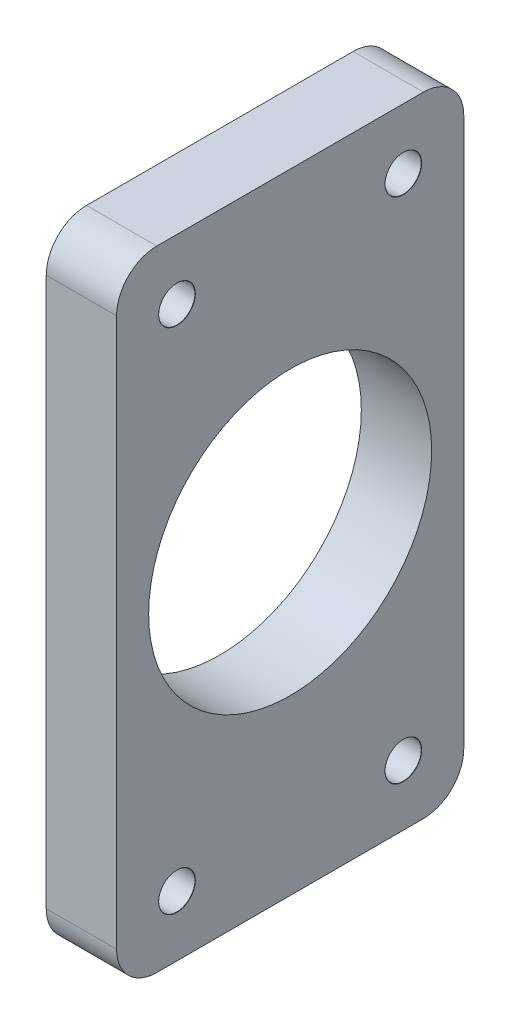
ISO-10303-21;
HEADER;
FILE_DESCRIPTION(('STEP AP214'),'2;1');
FILE_NAME('part.step','',(''),(''),'','','');
FILE_SCHEMA(('AUTOMOTIVE_DESIGN { 1 0 10303 214 1 1 1 1 }'));
ENDSEC;
DATA;
#1=APPLICATION_CONTEXT('core data for automotive mechanical design processes');
#2=APPLICATION_PROTOCOL_DEFINITION('international standard','automotive_design',2000,#1);
#3=PRODUCT_CONTEXT('',#1,'mechanical');
#4=PRODUCT('Part','Part','',(#3));
#5=PRODUCT_RELATED_PRODUCT_CATEGORY('part','',(#4));
#6=PRODUCT_DEFINITION_FORMATION('','',#4);
#7=PRODUCT_DEFINITION_CONTEXT('part definition',#1,'design');
#8=PRODUCT_DEFINITION('design','',#6,#7);
#9=PRODUCT_DEFINITION_SHAPE('','',#8);
#10=(LENGTH_UNIT() NAMED_UNIT(*) SI_UNIT(.MILLI.,.METRE.));
#11=(NAMED_UNIT(*) PLANE_ANGLE_UNIT() SI_UNIT($,.RADIAN.));
#12=(NAMED_UNIT(*) SI_UNIT($,.STERADIAN.) SOLID_ANGLE_UNIT());
#13=UNCERTAINTY_MEASURE_WITH_UNIT(LENGTH_MEASURE(1.E-05),#10,'distance_accuracy_value','');
#14=(GEOMETRIC_REPRESENTATION_CONTEXT(3) GLOBAL_UNCERTAINTY_ASSIGNED_CONTEXT((#13)) GLOBAL_UNIT_ASSIGNED_CONTEXT((#10,
#11,#12)) REPRESENTATION_CONTEXT('',''));
#15=CARTESIAN_POINT('',(0.,0.,0.));
#16=DIRECTION('',(0.,0.,1.));
#17=DIRECTION('',(1.,0.,0.));
#18=AXIS2_PLACEMENT_3D('',#15,#16,#17);
#19=CARTESIAN_POINT('',(13.096875,-39.05,21.55));
#20=DIRECTION('',(0.,1.,0.));
#21=DIRECTION('',(0.,0.,1.));
#22=AXIS2_PLACEMENT_3D('',#19,#20,#21);
#23=PLANE('',#22);
#24=DIRECTION('',(0.,0.,-1.));
#25=VECTOR('',#24,1.);
#26=CARTESIAN_POINT('',(13.096875,-39.05,21.55));
#27=LINE('',#26,#25);
#28=CARTESIAN_POINT('',(13.096875,-39.05,16.55));
#29=VERTEX_POINT('',#28);
#30=CARTESIAN_POINT('',(13.096875,-39.05,-16.55));
#31=VERTEX_POINT('',#30);
#32=EDGE_CURVE('E556',#29,#31,#27,.T.);
#33=ORIENTED_EDGE('',*,*,#32,.F.);
#34=DIRECTION('',(-1.,0.,0.));
#35=VECTOR('',#34,1.);
#36=CARTESIAN_POINT('',(13.096875,-39.05,16.55));
#37=LINE('',#36,#35);
#38=CARTESIAN_POINT('',(4.365625,-39.05,16.55));
#39=VERTEX_POINT('',#38);
#40=EDGE_CURVE('E545',#29,#39,#37,.T.);
#41=ORIENTED_EDGE('',*,*,#40,.T.);
#42=DIRECTION('',(0.,0.,-1.));
#43=VECTOR('',#42,1.);
#44=CARTESIAN_POINT('',(4.365625,-39.05,21.55));
#45=LINE('',#44,#43);
#46=CARTESIAN_POINT('',(4.365625,-39.05,-16.55));
#47=VERTEX_POINT('',#46);
#48=EDGE_CURVE('E554',#39,#47,#45,.T.);
#49=ORIENTED_EDGE('',*,*,#48,.T.);
#50=DIRECTION('',(-1.,0.,0.));
#51=VECTOR('',#50,1.);
#52=CARTESIAN_POINT('',(13.096875,-39.05,-16.55));
#53=LINE('',#52,#51);
#54=EDGE_CURVE('E561',#47,#31,#53,.F.);
#55=ORIENTED_EDGE('',*,*,#54,.T.);
#56=EDGE_LOOP('',(#33,#41,#49,#55));
#57=FACE_BOUND('',#56,.T.);
#58=ADVANCED_FACE('F473',(#57),#23,.F.);
#59=CARTESIAN_POINT('',(13.096875,-39.05,-21.55));
#60=DIRECTION('',(0.,0.,1.));
#61=DIRECTION('',(1.,0.,0.));
#62=AXIS2_PLACEMENT_3D('',#59,#60,#61);
#63=PLANE('',#62);
#64=DIRECTION('',(0.,1.,0.));
#65=VECTOR('',#64,1.);
#66=CARTESIAN_POINT('',(4.365625,-39.05,-21.55));
#67=LINE('',#66,#65);
#68=CARTESIAN_POINT('',(4.365625,-34.05,-21.55));
#69=VERTEX_POINT('',#68);
#70=CARTESIAN_POINT('',(4.365625,34.05,-21.55));
#71=VERTEX_POINT('',#70);
#72=EDGE_CURVE('E570',#69,#71,#67,.T.);
#73=ORIENTED_EDGE('',*,*,#72,.T.);
#74=DIRECTION('',(-1.,0.,0.));
#75=VECTOR('',#74,1.);
#76=CARTESIAN_POINT('',(13.096875,34.05,-21.55));
#77=LINE('',#76,#75);
#78=CARTESIAN_POINT('',(13.096875,34.05,-21.55));
#79=VERTEX_POINT('',#78);
#80=EDGE_CURVE('E14',#71,#79,#77,.F.);
#81=ORIENTED_EDGE('',*,*,#80,.T.);
#82=DIRECTION('',(0.,1.,0.));
#83=VECTOR('',#82,1.);
#84=CARTESIAN_POINT('',(13.096875,-39.05,-21.55));
#85=LINE('',#84,#83);
#86=CARTESIAN_POINT('',(13.096875,-34.05,-21.55));
#87=VERTEX_POINT('',#86);
#88=EDGE_CURVE('E647',#87,#79,#85,.T.);
#89=ORIENTED_EDGE('',*,*,#88,.F.);
#90=DIRECTION('',(-1.,0.,0.));
#91=VECTOR('',#90,1.);
#92=CARTESIAN_POINT('',(13.096875,-34.05,-21.55));
#93=LINE('',#92,#91);
#94=EDGE_CURVE('E478',#87,#69,#93,.T.);
#95=ORIENTED_EDGE('',*,*,#94,.T.);
#96=EDGE_LOOP('',(#73,#81,#89,#95));
#97=FACE_BOUND('',#96,.T.);
#98=ADVANCED_FACE('F650',(#97),#63,.F.);
#99=CARTESIAN_POINT('',(13.096875,39.05,21.55));
#100=DIRECTION('',(0.,-1.,0.));
#101=DIRECTION('',(0.,0.,-1.));
#102=AXIS2_PLACEMENT_3D('',#99,#100,#101);
#103=PLANE('',#102);
#104=DIRECTION('',(0.,0.,1.));
#105=VECTOR('',#104,1.);
#106=CARTESIAN_POINT('',(13.096875,39.05,21.55));
#107=LINE('',#106,#105);
#108=CARTESIAN_POINT('',(13.096875,39.05,-16.55));
#109=VERTEX_POINT('',#108);
#110=CARTESIAN_POINT('',(13.096875,39.05,16.55));
#111=VERTEX_POINT('',#110);
#112=EDGE_CURVE('E660',#109,#111,#107,.T.);
#113=ORIENTED_EDGE('',*,*,#112,.F.);
#114=DIRECTION('',(-1.,0.,0.));
#115=VECTOR('',#114,1.);
#116=CARTESIAN_POINT('',(13.096875,39.05,-16.55));
#117=LINE('',#116,#115);
#118=CARTESIAN_POINT('',(4.365625,39.05,-16.55));
#119=VERTEX_POINT('',#118);
#120=EDGE_CURVE('E637',#109,#119,#117,.T.);
#121=ORIENTED_EDGE('',*,*,#120,.T.);
#122=DIRECTION('',(0.,0.,1.));
#123=VECTOR('',#122,1.);
#124=CARTESIAN_POINT('',(4.365625,39.05,21.55));
#125=LINE('',#124,#123);
#126=CARTESIAN_POINT('',(4.365625,39.05,16.55));
#127=VERTEX_POINT('',#126);
#128=EDGE_CURVE('E573',#119,#127,#125,.T.);
#129=ORIENTED_EDGE('',*,*,#128,.T.);
#130=DIRECTION('',(-1.,0.,0.));
#131=VECTOR('',#130,1.);
#132=CARTESIAN_POINT('',(13.096875,39.05,16.55));
#133=LINE('',#132,#131);
#134=EDGE_CURVE('E487',#127,#111,#133,.F.);
#135=ORIENTED_EDGE('',*,*,#134,.T.);
#136=EDGE_LOOP('',(#113,#121,#129,#135));
#137=FACE_BOUND('',#136,.T.);
#138=ADVANCED_FACE('F658',(#137),#103,.F.);
#139=CARTESIAN_POINT('',(13.096875,-39.05,21.55));
#140=DIRECTION('',(0.,0.,-1.));
#141=DIRECTION('',(-1.,0.,0.));
#142=AXIS2_PLACEMENT_3D('',#139,#140,#141);
#143=PLANE('',#142);
#144=DIRECTION('',(0.,-1.,0.));
#145=VECTOR('',#144,1.);
#146=CARTESIAN_POINT('',(4.365625,-39.05,21.55));
#147=LINE('',#146,#145);
#148=CARTESIAN_POINT('',(4.365625,34.05,21.55));
#149=VERTEX_POINT('',#148);
#150=CARTESIAN_POINT('',(4.365625,-34.05,21.55));
#151=VERTEX_POINT('',#150);
#152=EDGE_CURVE('E584',#149,#151,#147,.T.);
#153=ORIENTED_EDGE('',*,*,#152,.T.);
#154=DIRECTION('',(-1.,0.,0.));
#155=VECTOR('',#154,1.);
#156=CARTESIAN_POINT('',(13.096875,-34.05,21.55));
#157=LINE('',#156,#155);
#158=CARTESIAN_POINT('',(13.096875,-34.05,21.55));
#159=VERTEX_POINT('',#158);
#160=EDGE_CURVE('E544',#151,#159,#157,.F.);
#161=ORIENTED_EDGE('',*,*,#160,.T.);
#162=DIRECTION('',(0.,-1.,0.));
#163=VECTOR('',#162,1.);
#164=CARTESIAN_POINT('',(13.096875,-39.05,21.55));
#165=LINE('',#164,#163);
#166=CARTESIAN_POINT('',(13.096875,34.05,21.55));
#167=VERTEX_POINT('',#166);
#168=EDGE_CURVE('E578',#167,#159,#165,.T.);
#169=ORIENTED_EDGE('',*,*,#168,.F.);
#170=DIRECTION('',(-1.,0.,0.));
#171=VECTOR('',#170,1.);
#172=CARTESIAN_POINT('',(13.096875,34.05,21.55));
#173=LINE('',#172,#171);
#174=EDGE_CURVE('E547',#167,#149,#173,.T.);
#175=ORIENTED_EDGE('',*,*,#174,.T.);
#176=EDGE_LOOP('',(#153,#161,#169,#175));
#177=FACE_BOUND('',#176,.T.);
#178=ADVANCED_FACE('F702',(#177),#143,.F.);
#179=CARTESIAN_POINT('',(13.096875,0.,0.));
#180=DIRECTION('',(1.,0.,0.));
#181=DIRECTION('',(0.,0.,-1.));
#182=AXIS2_PLACEMENT_3D('',#179,#180,#181);
#183=PLANE('',#182);
#184=CARTESIAN_POINT('',(13.096875,0.,0.));
#185=DIRECTION('',(1.,0.,0.));
#186=DIRECTION('',(0.,0.,-1.));
#187=AXIS2_PLACEMENT_3D('',#184,#185,#186);
#188=CIRCLE('',#187,17.5641);
#189=CARTESIAN_POINT('',(13.096875,0.,-17.5641));
#190=VERTEX_POINT('',#189);
#191=EDGE_CURVE('E613',#190,#190,#188,.T.);
#192=ORIENTED_EDGE('',*,*,#191,.F.);
#193=EDGE_LOOP('',(#192));
#194=FACE_BOUND('',#193,.T.);
#195=CARTESIAN_POINT('',(13.096875,-31.55,14.05));
#196=DIRECTION('',(1.,0.,0.));
#197=DIRECTION('',(0.,0.,-1.));
#198=AXIS2_PLACEMENT_3D('',#195,#196,#197);
#199=CIRCLE('',#198,2.275);
#200=CARTESIAN_POINT('',(13.096875,-31.55,11.775));
#201=VERTEX_POINT('',#200);
#202=EDGE_CURVE('E608',#201,#201,#199,.T.);
#203=ORIENTED_EDGE('',*,*,#202,.F.);
#204=EDGE_LOOP('',(#203));
#205=FACE_BOUND('',#204,.T.);
#206=CARTESIAN_POINT('',(13.096875,-31.55,-14.05));
#207=DIRECTION('',(1.,0.,0.));
#208=DIRECTION('',(0.,0.,-1.));
#209=AXIS2_PLACEMENT_3D('',#206,#207,#208);
#210=CIRCLE('',#209,2.275);
#211=CARTESIAN_POINT('',(13.096875,-31.55,-16.325));
#212=VERTEX_POINT('',#211);
#213=EDGE_CURVE('E602',#212,#212,#210,.T.);
#214=ORIENTED_EDGE('',*,*,#213,.F.);
#215=EDGE_LOOP('',(#214));
#216=FACE_BOUND('',#215,.T.);
#217=CARTESIAN_POINT('',(13.096875,31.55,-14.05));
#218=DIRECTION('',(1.,0.,0.));
#219=DIRECTION('',(0.,0.,-1.));
#220=AXIS2_PLACEMENT_3D('',#217,#218,#219);
#221=CIRCLE('',#220,2.275);
#222=CARTESIAN_POINT('',(13.096875,31.55,-16.325));
#223=VERTEX_POINT('',#222);
#224=EDGE_CURVE('E596',#223,#223,#221,.T.);
#225=ORIENTED_EDGE('',*,*,#224,.F.);
#226=EDGE_LOOP('',(#225));
#227=FACE_BOUND('',#226,.T.);
#228=CARTESIAN_POINT('',(13.096875,31.55,14.05));
#229=DIRECTION('',(1.,0.,0.));
#230=DIRECTION('',(0.,0.,-1.));
#231=AXIS2_PLACEMENT_3D('',#228,#229,#230);
#232=CIRCLE('',#231,2.275);
#233=CARTESIAN_POINT('',(13.096875,31.55,11.775));
#234=VERTEX_POINT('',#233);
#235=EDGE_CURVE('E595',#234,#234,#232,.T.);
#236=ORIENTED_EDGE('',*,*,#235,.F.);
#237=EDGE_LOOP('',(#236));
#238=FACE_BOUND('',#237,.T.);
#239=ORIENTED_EDGE('',*,*,#168,.T.);
#240=CARTESIAN_POINT('',(13.096875,-34.05,16.55));
#241=DIRECTION('',(1.,0.,0.));
#242=DIRECTION('',(0.,0.,-1.));
#243=AXIS2_PLACEMENT_3D('',#240,#241,#242);
#244=CIRCLE('',#243,5.);
#245=EDGE_CURVE('E633',#159,#29,#244,.T.);
#246=ORIENTED_EDGE('',*,*,#245,.T.);
#247=ORIENTED_EDGE('',*,*,#32,.T.);
#248=CARTESIAN_POINT('',(13.096875,-34.05,-16.55));
#249=DIRECTION('',(1.,0.,0.));
#250=DIRECTION('',(0.,0.,-1.));
#251=AXIS2_PLACEMENT_3D('',#248,#249,#250);
#252=CIRCLE('',#251,5.);
#253=EDGE_CURVE('E628',#31,#87,#252,.T.);
#254=ORIENTED_EDGE('',*,*,#253,.T.);
#255=ORIENTED_EDGE('',*,*,#88,.T.);
#256=CARTESIAN_POINT('',(13.096875,34.05,-16.55));
#257=DIRECTION('',(1.,0.,0.));
#258=DIRECTION('',(0.,0.,-1.));
#259=AXIS2_PLACEMENT_3D('',#256,#257,#258);
#260=CIRCLE('',#259,5.);
#261=EDGE_CURVE('E494',#79,#109,#260,.T.);
#262=ORIENTED_EDGE('',*,*,#261,.T.);
#263=ORIENTED_EDGE('',*,*,#112,.T.);
#264=CARTESIAN_POINT('',(13.096875,34.05,16.55));
#265=DIRECTION('',(1.,0.,0.));
#266=DIRECTION('',(0.,0.,-1.));
#267=AXIS2_PLACEMENT_3D('',#264,#265,#266);
#268=CIRCLE('',#267,5.);
#269=EDGE_CURVE('E622',#111,#167,#268,.T.);
#270=ORIENTED_EDGE('',*,*,#269,.T.);
#271=EDGE_LOOP('',(#239,#246,#247,#254,#255,#262,#263,#270));
#272=FACE_BOUND('',#271,.T.);
#273=ADVANCED_FACE('F699',(#194,#205,#216,#227,#238,#272),#183,.T.);
#274=CARTESIAN_POINT('',(4.365625,0.,0.));
#275=DIRECTION('',(1.,0.,0.));
#276=DIRECTION('',(0.,0.,-1.));
#277=AXIS2_PLACEMENT_3D('',#274,#275,#276);
#278=PLANE('',#277);
#279=CARTESIAN_POINT('',(4.365625,0.,0.));
#280=DIRECTION('',(1.,0.,0.));
#281=DIRECTION('',(0.,0.,-1.));
#282=AXIS2_PLACEMENT_3D('',#279,#280,#281);
#283=CIRCLE('',#282,17.5641);
#284=CARTESIAN_POINT('',(4.365625,0.,-17.5641));
#285=VERTEX_POINT('',#284);
#286=EDGE_CURVE('E607',#285,#285,#283,.T.);
#287=ORIENTED_EDGE('',*,*,#286,.T.);
#288=EDGE_LOOP('',(#287));
#289=FACE_BOUND('',#288,.T.);
#290=CARTESIAN_POINT('',(4.365625,-31.55,14.05));
#291=DIRECTION('',(1.,0.,0.));
#292=DIRECTION('',(0.,0.,-1.));
#293=AXIS2_PLACEMENT_3D('',#290,#291,#292);
#294=CIRCLE('',#293,2.25);
#295=CARTESIAN_POINT('',(4.365625,-31.55,11.8));
#296=VERTEX_POINT('',#295);
#297=EDGE_CURVE('E598',#296,#296,#294,.T.);
#298=ORIENTED_EDGE('',*,*,#297,.T.);
#299=EDGE_LOOP('',(#298));
#300=FACE_BOUND('',#299,.T.);
#301=CARTESIAN_POINT('',(4.365625,-31.55,-14.05));
#302=DIRECTION('',(1.,0.,0.));
#303=DIRECTION('',(0.,0.,-1.));
#304=AXIS2_PLACEMENT_3D('',#301,#302,#303);
#305=CIRCLE('',#304,2.25);
#306=CARTESIAN_POINT('',(4.365625,-31.55,-16.3));
#307=VERTEX_POINT('',#306);
#308=EDGE_CURVE('E592',#307,#307,#305,.T.);
#309=ORIENTED_EDGE('',*,*,#308,.T.);
#310=EDGE_LOOP('',(#309));
#311=FACE_BOUND('',#310,.T.);
#312=CARTESIAN_POINT('',(4.365625,31.55,-14.05));
#313=DIRECTION('',(1.,0.,0.));
#314=DIRECTION('',(0.,0.,-1.));
#315=AXIS2_PLACEMENT_3D('',#312,#313,#314);
#316=CIRCLE('',#315,2.25);
#317=CARTESIAN_POINT('',(4.365625,31.55,-16.3));
#318=VERTEX_POINT('',#317);
#319=EDGE_CURVE('E589',#318,#318,#316,.T.);
#320=ORIENTED_EDGE('',*,*,#319,.T.);
#321=EDGE_LOOP('',(#320));
#322=FACE_BOUND('',#321,.T.);
#323=CARTESIAN_POINT('',(4.365625,31.55,14.05));
#324=DIRECTION('',(1.,0.,0.));
#325=DIRECTION('',(0.,0.,-1.));
#326=AXIS2_PLACEMENT_3D('',#323,#324,#325);
#327=CIRCLE('',#326,2.25);
#328=CARTESIAN_POINT('',(4.365625,31.55,11.8));
#329=VERTEX_POINT('',#328);
#330=EDGE_CURVE('E568',#329,#329,#327,.T.);
#331=ORIENTED_EDGE('',*,*,#330,.T.);
#332=EDGE_LOOP('',(#331));
#333=FACE_BOUND('',#332,.T.);
#334=ORIENTED_EDGE('',*,*,#48,.F.);
#335=CARTESIAN_POINT('',(4.365625,-34.05,16.55));
#336=DIRECTION('',(1.,0.,0.));
#337=DIRECTION('',(0.,0.,-1.));
#338=AXIS2_PLACEMENT_3D('',#335,#336,#337);
#339=CIRCLE('',#338,5.);
#340=EDGE_CURVE('E536',#39,#151,#339,.F.);
#341=ORIENTED_EDGE('',*,*,#340,.T.);
#342=ORIENTED_EDGE('',*,*,#152,.F.);
#343=CARTESIAN_POINT('',(4.365625,34.05,16.55));
#344=DIRECTION('',(1.,0.,0.));
#345=DIRECTION('',(0.,0.,-1.));
#346=AXIS2_PLACEMENT_3D('',#343,#344,#345);
#347=CIRCLE('',#346,5.);
#348=EDGE_CURVE('E557',#149,#127,#347,.F.);
#349=ORIENTED_EDGE('',*,*,#348,.T.);
#350=ORIENTED_EDGE('',*,*,#128,.F.);
#351=CARTESIAN_POINT('',(4.365625,34.05,-16.55));
#352=DIRECTION('',(1.,0.,0.));
#353=DIRECTION('',(0.,0.,-1.));
#354=AXIS2_PLACEMENT_3D('',#351,#352,#353);
#355=CIRCLE('',#354,5.);
#356=EDGE_CURVE('E549',#119,#71,#355,.F.);
#357=ORIENTED_EDGE('',*,*,#356,.T.);
#358=ORIENTED_EDGE('',*,*,#72,.F.);
#359=CARTESIAN_POINT('',(4.365625,-34.05,-16.55));
#360=DIRECTION('',(1.,0.,0.));
#361=DIRECTION('',(0.,0.,-1.));
#362=AXIS2_PLACEMENT_3D('',#359,#360,#361);
#363=CIRCLE('',#362,5.);
#364=EDGE_CURVE('E564',#69,#47,#363,.F.);
#365=ORIENTED_EDGE('',*,*,#364,.T.);
#366=EDGE_LOOP('',(#334,#341,#342,#349,#350,#357,#358,#365));
#367=FACE_BOUND('',#366,.T.);
#368=ADVANCED_FACE('F563',(#289,#300,#311,#322,#333,#367),#278,.F.);
#369=CARTESIAN_POINT('',(13.096875,31.55,14.05));
#370=DIRECTION('',(1.,0.,0.));
#371=DIRECTION('',(0.,0.,-1.));
#372=AXIS2_PLACEMENT_3D('',#369,#370,#371);
#373=CYLINDRICAL_SURFACE('',#372,2.25);
#374=CARTESIAN_POINT('',(13.071875,31.55,14.05));
#375=DIRECTION('',(1.,0.,0.));
#376=DIRECTION('',(0.,0.,-1.));
#377=AXIS2_PLACEMENT_3D('',#374,#375,#376);
#378=CIRCLE('',#377,2.25);
#379=CARTESIAN_POINT('',(13.071875,31.55,11.8));
#380=VERTEX_POINT('',#379);
#381=EDGE_CURVE('E580',#380,#380,#378,.T.);
#382=ORIENTED_EDGE('',*,*,#381,.T.);
#383=EDGE_LOOP('',(#382));
#384=FACE_BOUND('',#383,.T.);
#385=ORIENTED_EDGE('',*,*,#330,.F.);
#386=EDGE_LOOP('',(#385));
#387=FACE_BOUND('',#386,.T.);
#388=ADVANCED_FACE('F825',(#384,#387),#373,.F.);
#389=CARTESIAN_POINT('',(13.096875,31.55,14.05));
#390=DIRECTION('',(1.,0.,0.));
#391=DIRECTION('',(0.,0.,-1.));
#392=AXIS2_PLACEMENT_3D('',#389,#390,#391);
#393=CONICAL_SURFACE('',#392,2.275,0.785398163397448);
#394=ORIENTED_EDGE('',*,*,#381,.F.);
#395=EDGE_LOOP('',(#394));
#396=FACE_BOUND('',#395,.T.);
#397=ORIENTED_EDGE('',*,*,#235,.T.);
#398=EDGE_LOOP('',(#397));
#399=FACE_BOUND('',#398,.T.);
#400=ADVANCED_FACE('F811',(#396,#399),#393,.F.);
#401=CARTESIAN_POINT('',(13.096875,31.55,-14.05));
#402=DIRECTION('',(1.,0.,0.));
#403=DIRECTION('',(0.,0.,-1.));
#404=AXIS2_PLACEMENT_3D('',#401,#402,#403);
#405=CYLINDRICAL_SURFACE('',#404,2.25);
#406=CARTESIAN_POINT('',(13.071875,31.55,-14.05));
#407=DIRECTION('',(1.,0.,0.));
#408=DIRECTION('',(0.,0.,-1.));
#409=AXIS2_PLACEMENT_3D('',#406,#407,#408);
#410=CIRCLE('',#409,2.25);
#411=CARTESIAN_POINT('',(13.071875,31.55,-16.3));
#412=VERTEX_POINT('',#411);
#413=EDGE_CURVE('E591',#412,#412,#410,.T.);
#414=ORIENTED_EDGE('',*,*,#413,.T.);
#415=EDGE_LOOP('',(#414));
#416=FACE_BOUND('',#415,.T.);
#417=ORIENTED_EDGE('',*,*,#319,.F.);
#418=EDGE_LOOP('',(#417));
#419=FACE_BOUND('',#418,.T.);
#420=ADVANCED_FACE('F801',(#416,#419),#405,.F.);
#421=CARTESIAN_POINT('',(13.096875,31.55,-14.05));
#422=DIRECTION('',(1.,0.,0.));
#423=DIRECTION('',(0.,0.,-1.));
#424=AXIS2_PLACEMENT_3D('',#421,#422,#423);
#425=CONICAL_SURFACE('',#424,2.275,0.785398163397448);
#426=ORIENTED_EDGE('',*,*,#413,.F.);
#427=EDGE_LOOP('',(#426));
#428=FACE_BOUND('',#427,.T.);
#429=ORIENTED_EDGE('',*,*,#224,.T.);
#430=EDGE_LOOP('',(#429));
#431=FACE_BOUND('',#430,.T.);
#432=ADVANCED_FACE('F793',(#428,#431),#425,.F.);
#433=CARTESIAN_POINT('',(13.096875,-31.55,-14.05));
#434=DIRECTION('',(1.,0.,0.));
#435=DIRECTION('',(0.,0.,-1.));
#436=AXIS2_PLACEMENT_3D('',#433,#434,#435);
#437=CYLINDRICAL_SURFACE('',#436,2.25);
#438=CARTESIAN_POINT('',(13.071875,-31.55,-14.05));
#439=DIRECTION('',(1.,0.,0.));
#440=DIRECTION('',(0.,0.,-1.));
#441=AXIS2_PLACEMENT_3D('',#438,#439,#440);
#442=CIRCLE('',#441,2.25);
#443=CARTESIAN_POINT('',(13.071875,-31.55,-16.3));
#444=VERTEX_POINT('',#443);
#445=EDGE_CURVE('E599',#444,#444,#442,.T.);
#446=ORIENTED_EDGE('',*,*,#445,.T.);
#447=EDGE_LOOP('',(#446));
#448=FACE_BOUND('',#447,.T.);
#449=ORIENTED_EDGE('',*,*,#308,.F.);
#450=EDGE_LOOP('',(#449));
#451=FACE_BOUND('',#450,.T.);
#452=ADVANCED_FACE('F788',(#448,#451),#437,.F.);
#453=CARTESIAN_POINT('',(13.096875,-31.55,-14.05));
#454=DIRECTION('',(1.,0.,0.));
#455=DIRECTION('',(0.,0.,-1.));
#456=AXIS2_PLACEMENT_3D('',#453,#454,#455);
#457=CONICAL_SURFACE('',#456,2.275,0.785398163397379);
#458=ORIENTED_EDGE('',*,*,#445,.F.);
#459=EDGE_LOOP('',(#458));
#460=FACE_BOUND('',#459,.T.);
#461=ORIENTED_EDGE('',*,*,#213,.T.);
#462=EDGE_LOOP('',(#461));
#463=FACE_BOUND('',#462,.T.);
#464=ADVANCED_FACE('F780',(#460,#463),#457,.F.);
#465=CARTESIAN_POINT('',(13.096875,-31.55,14.05));
#466=DIRECTION('',(1.,0.,0.));
#467=DIRECTION('',(0.,0.,-1.));
#468=AXIS2_PLACEMENT_3D('',#465,#466,#467);
#469=CYLINDRICAL_SURFACE('',#468,2.25);
#470=CARTESIAN_POINT('',(13.071875,-31.55,14.05));
#471=DIRECTION('',(1.,0.,0.));
#472=DIRECTION('',(0.,0.,-1.));
#473=AXIS2_PLACEMENT_3D('',#470,#471,#472);
#474=CIRCLE('',#473,2.25);
#475=CARTESIAN_POINT('',(13.071875,-31.55,11.8));
#476=VERTEX_POINT('',#475);
#477=EDGE_CURVE('E604',#476,#476,#474,.T.);
#478=ORIENTED_EDGE('',*,*,#477,.T.);
#479=EDGE_LOOP('',(#478));
#480=FACE_BOUND('',#479,.T.);
#481=ORIENTED_EDGE('',*,*,#297,.F.);
#482=EDGE_LOOP('',(#481));
#483=FACE_BOUND('',#482,.T.);
#484=ADVANCED_FACE('F767',(#480,#483),#469,.F.);
#485=CARTESIAN_POINT('',(13.096875,-31.55,14.05));
#486=DIRECTION('',(1.,0.,0.));
#487=DIRECTION('',(0.,0.,-1.));
#488=AXIS2_PLACEMENT_3D('',#485,#486,#487);
#489=CONICAL_SURFACE('',#488,2.275,0.785398163397379);
#490=ORIENTED_EDGE('',*,*,#477,.F.);
#491=EDGE_LOOP('',(#490));
#492=FACE_BOUND('',#491,.T.);
#493=ORIENTED_EDGE('',*,*,#202,.T.);
#494=EDGE_LOOP('',(#493));
#495=FACE_BOUND('',#494,.T.);
#496=ADVANCED_FACE('F759',(#492,#495),#489,.F.);
#497=CARTESIAN_POINT('',(-13.096875,0.,0.));
#498=DIRECTION('',(1.,0.,0.));
#499=DIRECTION('',(0.,0.,-1.));
#500=AXIS2_PLACEMENT_3D('',#497,#498,#499);
#501=CYLINDRICAL_SURFACE('',#500,17.5641);
#502=CARTESIAN_POINT('',(13.096875,0.,-17.5641));
#503=CARTESIAN_POINT('',(13.0059244791667,0.,-17.5641));
#504=CARTESIAN_POINT('',(12.9149739583333,0.,-17.5641));
#505=CARTESIAN_POINT('',(12.7330729166667,0.,-17.5641));
#506=CARTESIAN_POINT('',(12.6421223958333,0.,-17.5641));
#507=CARTESIAN_POINT('',(12.4602213541667,0.,-17.5641));
#508=CARTESIAN_POINT('',(12.3692708333333,0.,-17.5641));
#509=CARTESIAN_POINT('',(12.1873697916667,0.,-17.5641));
#510=CARTESIAN_POINT('',(12.0964192708333,0.,-17.5641));
#511=CARTESIAN_POINT('',(11.9145182291667,0.,-17.5641));
#512=CARTESIAN_POINT('',(11.8235677083333,0.,-17.5641));
#513=CARTESIAN_POINT('',(11.6416666666667,0.,-17.5641));
#514=CARTESIAN_POINT('',(11.5507161458333,0.,-17.5641));
#515=CARTESIAN_POINT('',(11.3688151041667,0.,-17.5641));
#516=CARTESIAN_POINT('',(11.2778645833333,0.,-17.5641));
#517=CARTESIAN_POINT('',(11.0959635416667,0.,-17.5641));
#518=CARTESIAN_POINT('',(11.0050130208333,0.,-17.5641));
#519=CARTESIAN_POINT('',(10.8231119791667,0.,-17.5641));
#520=CARTESIAN_POINT('',(10.7321614583333,0.,-17.5641));
#521=CARTESIAN_POINT('',(10.5502604166667,0.,-17.5641));
#522=CARTESIAN_POINT('',(10.4593098958333,0.,-17.5641));
#523=CARTESIAN_POINT('',(10.2774088541667,0.,-17.5641));
#524=CARTESIAN_POINT('',(10.1864583333333,0.,-17.5641));
#525=CARTESIAN_POINT('',(10.0045572916667,0.,-17.5641));
#526=CARTESIAN_POINT('',(9.91360677083333,0.,-17.5641));
#527=CARTESIAN_POINT('',(9.73170572916666,0.,-17.5641));
#528=CARTESIAN_POINT('',(9.64075520833333,0.,-17.5641));
#529=CARTESIAN_POINT('',(9.45885416666666,0.,-17.5641));
#530=CARTESIAN_POINT('',(9.36790364583333,0.,-17.5641));
#531=CARTESIAN_POINT('',(9.18600260416666,0.,-17.5641));
#532=CARTESIAN_POINT('',(9.09505208333333,0.,-17.5641));
#533=CARTESIAN_POINT('',(8.91315104166666,0.,-17.5641));
#534=CARTESIAN_POINT('',(8.82220052083333,0.,-17.5641));
#535=CARTESIAN_POINT('',(8.64029947916667,0.,-17.5641));
#536=CARTESIAN_POINT('',(8.54934895833333,0.,-17.5641));
#537=CARTESIAN_POINT('',(8.36744791666667,0.,-17.5641));
#538=CARTESIAN_POINT('',(8.27649739583333,0.,-17.5641));
#539=CARTESIAN_POINT('',(8.09459635416667,0.,-17.5641));
#540=CARTESIAN_POINT('',(8.00364583333333,0.,-17.5641));
#541=CARTESIAN_POINT('',(7.82174479166666,0.,-17.5641));
#542=CARTESIAN_POINT('',(7.73079427083333,0.,-17.5641));
#543=CARTESIAN_POINT('',(7.54889322916666,0.,-17.5641));
#544=CARTESIAN_POINT('',(7.45794270833333,0.,-17.5641));
#545=CARTESIAN_POINT('',(7.27604166666667,0.,-17.5641));
#546=CARTESIAN_POINT('',(7.18509114583333,0.,-17.5641));
#547=CARTESIAN_POINT('',(7.00319010416666,0.,-17.5641));
#548=CARTESIAN_POINT('',(6.91223958333333,0.,-17.5641));
#549=CARTESIAN_POINT('',(6.73033854166666,0.,-17.5641));
#550=CARTESIAN_POINT('',(6.63938802083333,0.,-17.5641));
#551=CARTESIAN_POINT('',(6.45748697916667,0.,-17.5641));
#552=CARTESIAN_POINT('',(6.36653645833333,0.,-17.5641));
#553=CARTESIAN_POINT('',(6.18463541666667,0.,-17.5641));
#554=CARTESIAN_POINT('',(6.09368489583333,0.,-17.5641));
#555=CARTESIAN_POINT('',(5.91178385416667,0.,-17.5641));
#556=CARTESIAN_POINT('',(5.82083333333333,0.,-17.5641));
#557=CARTESIAN_POINT('',(5.63893229166666,0.,-17.5641));
#558=CARTESIAN_POINT('',(5.54798177083333,0.,-17.5641));
#559=CARTESIAN_POINT('',(5.36608072916667,0.,-17.5641));
#560=CARTESIAN_POINT('',(5.27513020833333,0.,-17.5641));
#561=CARTESIAN_POINT('',(5.09322916666667,0.,-17.5641));
#562=CARTESIAN_POINT('',(5.00227864583333,0.,-17.5641));
#563=CARTESIAN_POINT('',(4.82037760416666,0.,-17.5641));
#564=CARTESIAN_POINT('',(4.72942708333333,0.,-17.5641));
#565=CARTESIAN_POINT('',(4.54752604166667,0.,-17.5641));
#566=CARTESIAN_POINT('',(4.45657552083333,0.,-17.5641));
#567=CARTESIAN_POINT('',(4.365625,0.,-17.5641));
#568=B_SPLINE_CURVE_WITH_KNOTS('',3,(#502,#503,#504,#505,#506,#507,#508,#509,#510,#511,#512,
#513,#514,#515,#516,#517,#518,#519,#520,#521,#522,#523,#524,#525,#526,#527,#528,#529,#530,#531,
#532,#533,#534,#535,#536,#537,#538,#539,#540,#541,#542,#543,#544,#545,#546,#547,#548,#549,#550,
#551,#552,#553,#554,#555,#556,#557,#558,#559,#560,#561,#562,#563,#564,#565,#566,#567),
.UNSPECIFIED.,.F.,.F.,(4,2,2,2,2,2,2,2,2,2,2,2,2,2,2,2,2,2,2,2,2,2,2,2,2,2,2,2,2,2,2,2,4),(0.,
0.272851562499999,0.545703124999998,0.8185546875,1.09140625,1.3642578125,1.637109375,
1.9099609375,2.1828125,2.4556640625,2.728515625,3.0013671875,3.27421875,3.5470703125,
3.819921875,4.0927734375,4.365625,4.6384765625,4.911328125,5.1841796875,5.45703125,5.7298828125,
6.002734375,6.2755859375,6.5484375,6.8212890625,7.094140625,7.3669921875,7.63984375,
7.9126953125,8.185546875,8.4583984375,8.73125),.UNSPECIFIED.);
#569=EDGE_CURVE('BSEAM700',#190,#285,#568,.T.);
#570=ORIENTED_EDGE('',*,*,#191,.T.);
#571=ORIENTED_EDGE('',*,*,#286,.F.);
#572=ORIENTED_EDGE('',*,*,#569,.T.);
#573=ORIENTED_EDGE('',*,*,#569,.F.);
#574=EDGE_LOOP('',(#570,#572,#571,#573));
#575=FACE_BOUND('',#574,.T.);
#576=ADVANCED_FACE('F700',(#575),#501,.F.);
#577=CARTESIAN_POINT('',(13.096875,-34.05,16.55));
#578=DIRECTION('',(-1.,0.,0.));
#579=DIRECTION('',(0.,0.,1.));
#580=AXIS2_PLACEMENT_3D('',#577,#578,#579);
#581=CYLINDRICAL_SURFACE('',#580,5.);
#582=ORIENTED_EDGE('',*,*,#245,.F.);
#583=ORIENTED_EDGE('',*,*,#160,.F.);
#584=ORIENTED_EDGE('',*,*,#340,.F.);
#585=ORIENTED_EDGE('',*,*,#40,.F.);
#586=EDGE_LOOP('',(#582,#583,#584,#585));
#587=FACE_BOUND('',#586,.T.);
#588=ADVANCED_FACE('F542',(#587),#581,.T.);
#589=CARTESIAN_POINT('',(13.096875,34.05,-16.55));
#590=DIRECTION('',(-1.,0.,0.));
#591=DIRECTION('',(0.,0.,1.));
#592=AXIS2_PLACEMENT_3D('',#589,#590,#591);
#593=CYLINDRICAL_SURFACE('',#592,5.);
#594=ORIENTED_EDGE('',*,*,#261,.F.);
#595=ORIENTED_EDGE('',*,*,#80,.F.);
#596=ORIENTED_EDGE('',*,*,#356,.F.);
#597=ORIENTED_EDGE('',*,*,#120,.F.);
#598=EDGE_LOOP('',(#594,#595,#596,#597));
#599=FACE_BOUND('',#598,.T.);
#600=ADVANCED_FACE('F653',(#599),#593,.T.);
#601=CARTESIAN_POINT('',(13.096875,-34.05,-16.55));
#602=DIRECTION('',(-1.,0.,0.));
#603=DIRECTION('',(0.,0.,1.));
#604=AXIS2_PLACEMENT_3D('',#601,#602,#603);
#605=CYLINDRICAL_SURFACE('',#604,5.);
#606=ORIENTED_EDGE('',*,*,#253,.F.);
#607=ORIENTED_EDGE('',*,*,#54,.F.);
#608=ORIENTED_EDGE('',*,*,#364,.F.);
#609=ORIENTED_EDGE('',*,*,#94,.F.);
#610=EDGE_LOOP('',(#606,#607,#608,#609));
#611=FACE_BOUND('',#610,.T.);
#612=ADVANCED_FACE('F720',(#611),#605,.T.);
#613=CARTESIAN_POINT('',(13.096875,34.05,16.55));
#614=DIRECTION('',(-1.,0.,0.));
#615=DIRECTION('',(0.,0.,1.));
#616=AXIS2_PLACEMENT_3D('',#613,#614,#615);
#617=CYLINDRICAL_SURFACE('',#616,5.);
#618=ORIENTED_EDGE('',*,*,#269,.F.);
#619=ORIENTED_EDGE('',*,*,#134,.F.);
#620=ORIENTED_EDGE('',*,*,#348,.F.);
#621=ORIENTED_EDGE('',*,*,#174,.F.);
#622=EDGE_LOOP('',(#618,#619,#620,#621));
#623=FACE_BOUND('',#622,.T.);
#624=ADVANCED_FACE('F471',(#623),#617,.T.);
#625=CLOSED_SHELL('',(#58,#98,#138,#178,#273,#368,#388,#400,#420,#432,#452,#464,#484,#496,#576,
#588,#600,#612,#624));
#626=MANIFOLD_SOLID_BREP('B2',#625);
#627=ADVANCED_BREP_SHAPE_REPRESENTATION('',(#18,#626),#14);
#628=SHAPE_DEFINITION_REPRESENTATION(#9,#627);
ENDSEC;
END-ISO-10303-21;
